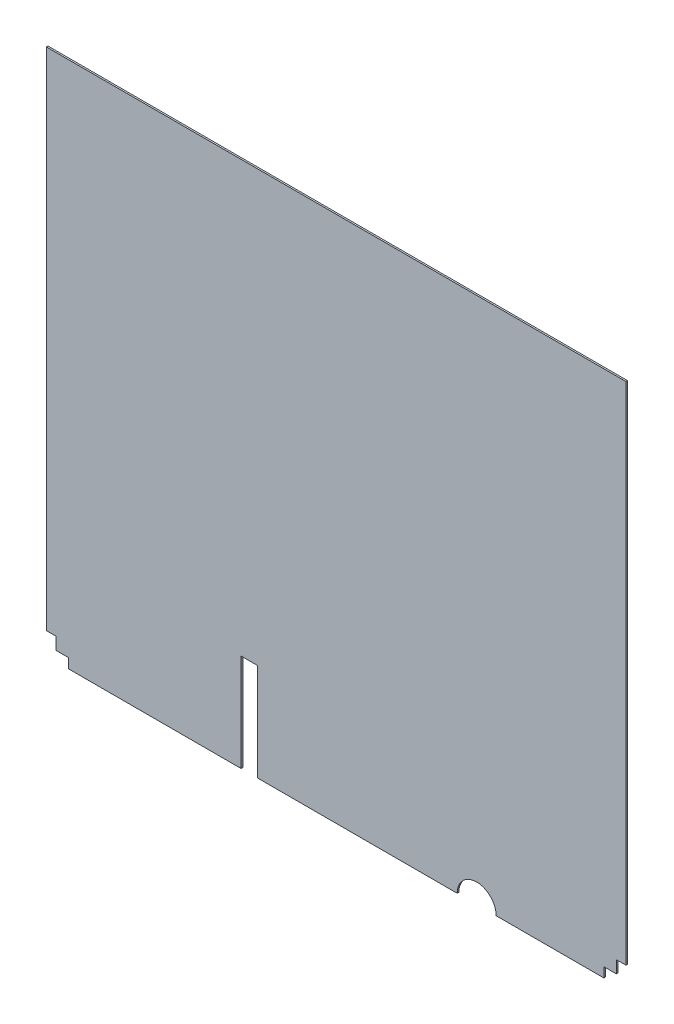
ISO-10303-21;
HEADER;
FILE_DESCRIPTION(('STEP AP214'),'2;1');
FILE_NAME('part.step','',(''),(''),'','','');
FILE_SCHEMA(('AUTOMOTIVE_DESIGN { 1 0 10303 214 1 1 1 1 }'));
ENDSEC;
DATA;
#1=APPLICATION_CONTEXT('core data for automotive mechanical design processes');
#2=APPLICATION_PROTOCOL_DEFINITION('international standard','automotive_design',2000,#1);
#3=PRODUCT_CONTEXT('',#1,'mechanical');
#4=PRODUCT('Part','Part','',(#3));
#5=PRODUCT_RELATED_PRODUCT_CATEGORY('part','',(#4));
#6=PRODUCT_DEFINITION_FORMATION('','',#4);
#7=PRODUCT_DEFINITION_CONTEXT('part definition',#1,'design');
#8=PRODUCT_DEFINITION('design','',#6,#7);
#9=PRODUCT_DEFINITION_SHAPE('','',#8);
#10=(LENGTH_UNIT() NAMED_UNIT(*) SI_UNIT(.MILLI.,.METRE.));
#11=(NAMED_UNIT(*) PLANE_ANGLE_UNIT() SI_UNIT($,.RADIAN.));
#12=(NAMED_UNIT(*) SI_UNIT($,.STERADIAN.) SOLID_ANGLE_UNIT());
#13=UNCERTAINTY_MEASURE_WITH_UNIT(LENGTH_MEASURE(1.E-05),#10,'distance_accuracy_value','');
#14=(GEOMETRIC_REPRESENTATION_CONTEXT(3) GLOBAL_UNCERTAINTY_ASSIGNED_CONTEXT((#13)) GLOBAL_UNIT_ASSIGNED_CONTEXT((#10,
#11,#12)) REPRESENTATION_CONTEXT('',''));
#15=CARTESIAN_POINT('',(0.,0.,0.));
#16=DIRECTION('',(0.,0.,1.));
#17=DIRECTION('',(1.,0.,0.));
#18=AXIS2_PLACEMENT_3D('',#15,#16,#17);
#19=CARTESIAN_POINT('',(673.32098,0.,2.54));
#20=DIRECTION('',(0.,0.,-1.));
#21=DIRECTION('',(-1.,0.,0.));
#22=AXIS2_PLACEMENT_3D('',#19,#20,#21);
#23=CYLINDRICAL_SURFACE('',#22,30.48);
#24=CARTESIAN_POINT('',(673.32098,0.,0.));
#25=DIRECTION('',(0.,0.,1.));
#26=DIRECTION('',(1.,0.,0.));
#27=AXIS2_PLACEMENT_3D('',#24,#25,#26);
#28=CIRCLE('',#27,30.48);
#29=CARTESIAN_POINT('',(703.80098,0.,0.));
#30=VERTEX_POINT('',#29);
#31=CARTESIAN_POINT('',(642.84098,0.,0.));
#32=VERTEX_POINT('',#31);
#33=EDGE_CURVE('E207',#30,#32,#28,.T.);
#34=ORIENTED_EDGE('',*,*,#33,.F.);
#35=DIRECTION('',(0.,0.,-1.));
#36=VECTOR('',#35,1.);
#37=CARTESIAN_POINT('',(703.80098,0.,2.54));
#38=LINE('',#37,#36);
#39=CARTESIAN_POINT('',(703.80098,0.,2.54));
#40=VERTEX_POINT('',#39);
#41=EDGE_CURVE('E11',#40,#30,#38,.T.);
#42=ORIENTED_EDGE('',*,*,#41,.F.);
#43=CARTESIAN_POINT('',(673.32098,0.,2.54));
#44=DIRECTION('',(0.,0.,1.));
#45=DIRECTION('',(1.,0.,0.));
#46=AXIS2_PLACEMENT_3D('',#43,#44,#45);
#47=CIRCLE('',#46,30.48);
#48=CARTESIAN_POINT('',(642.84098,0.,2.54));
#49=VERTEX_POINT('',#48);
#50=EDGE_CURVE('E338',#40,#49,#47,.T.);
#51=ORIENTED_EDGE('',*,*,#50,.T.);
#52=DIRECTION('',(0.,0.,-1.));
#53=VECTOR('',#52,1.);
#54=CARTESIAN_POINT('',(642.84098,0.,2.54));
#55=LINE('',#54,#53);
#56=EDGE_CURVE('E129',#49,#32,#55,.T.);
#57=ORIENTED_EDGE('',*,*,#56,.T.);
#58=EDGE_LOOP('',(#34,#42,#51,#57));
#59=FACE_BOUND('',#58,.T.);
#60=ADVANCED_FACE('F47',(#59),#23,.F.);
#61=CARTESIAN_POINT('',(0.,0.,2.54));
#62=DIRECTION('',(0.,1.,0.));
#63=DIRECTION('',(0.,0.,1.));
#64=AXIS2_PLACEMENT_3D('',#61,#62,#63);
#65=PLANE('',#64);
#66=DIRECTION('',(1.,0.,0.));
#67=VECTOR('',#66,1.);
#68=CARTESIAN_POINT('',(0.,0.,0.));
#69=LINE('',#68,#67);
#70=CARTESIAN_POINT('',(872.45698,0.,0.));
#71=VERTEX_POINT('',#70);
#72=EDGE_CURVE('E211',#30,#71,#69,.T.);
#73=ORIENTED_EDGE('',*,*,#72,.T.);
#74=DIRECTION('',(0.,0.,-1.));
#75=VECTOR('',#74,1.);
#76=CARTESIAN_POINT('',(872.45698,0.,2.54));
#77=LINE('',#76,#75);
#78=CARTESIAN_POINT('',(872.45698,0.,2.54));
#79=VERTEX_POINT('',#78);
#80=EDGE_CURVE('E56',#79,#71,#77,.T.);
#81=ORIENTED_EDGE('',*,*,#80,.F.);
#82=DIRECTION('',(1.,0.,0.));
#83=VECTOR('',#82,1.);
#84=CARTESIAN_POINT('',(0.,0.,2.54));
#85=LINE('',#84,#83);
#86=EDGE_CURVE('E204',#40,#79,#85,.T.);
#87=ORIENTED_EDGE('',*,*,#86,.F.);
#88=ORIENTED_EDGE('',*,*,#41,.T.);
#89=EDGE_LOOP('',(#73,#81,#87,#88));
#90=FACE_BOUND('',#89,.T.);
#91=ADVANCED_FACE('F320',(#90),#65,.F.);
#92=CARTESIAN_POINT('',(872.45698,0.,2.54));
#93=DIRECTION('',(1.,0.,0.));
#94=DIRECTION('',(0.,0.,-1.));
#95=AXIS2_PLACEMENT_3D('',#92,#93,#94);
#96=PLANE('',#95);
#97=DIRECTION('',(0.,-1.,0.));
#98=VECTOR('',#97,1.);
#99=CARTESIAN_POINT('',(872.45698,0.,0.));
#100=LINE('',#99,#98);
#101=CARTESIAN_POINT('',(872.45698,15.24,0.));
#102=VERTEX_POINT('',#101);
#103=EDGE_CURVE('E215',#102,#71,#100,.T.);
#104=ORIENTED_EDGE('',*,*,#103,.F.);
#105=DIRECTION('',(0.,0.,-1.));
#106=VECTOR('',#105,1.);
#107=CARTESIAN_POINT('',(872.45698,15.24,2.54));
#108=LINE('',#107,#106);
#109=CARTESIAN_POINT('',(872.45698,15.24,2.54));
#110=VERTEX_POINT('',#109);
#111=EDGE_CURVE('E308',#110,#102,#108,.T.);
#112=ORIENTED_EDGE('',*,*,#111,.F.);
#113=DIRECTION('',(0.,-1.,0.));
#114=VECTOR('',#113,1.);
#115=CARTESIAN_POINT('',(872.45698,0.,2.54));
#116=LINE('',#115,#114);
#117=EDGE_CURVE('E317',#110,#79,#116,.T.);
#118=ORIENTED_EDGE('',*,*,#117,.T.);
#119=ORIENTED_EDGE('',*,*,#80,.T.);
#120=EDGE_LOOP('',(#104,#112,#118,#119));
#121=FACE_BOUND('',#120,.T.);
#122=ADVANCED_FACE('F315',(#121),#96,.T.);
#123=CARTESIAN_POINT('',(0.,15.2399999999999,2.54));
#124=DIRECTION('',(0.,-1.,0.));
#125=DIRECTION('',(1.,0.,0.));
#126=AXIS2_PLACEMENT_3D('',#123,#124,#125);
#127=PLANE('',#126);
#128=DIRECTION('',(-1.,0.,0.));
#129=VECTOR('',#128,1.);
#130=CARTESIAN_POINT('',(0.,15.2399999999999,0.));
#131=LINE('',#130,#129);
#132=CARTESIAN_POINT('',(891.76098,15.24,0.));
#133=VERTEX_POINT('',#132);
#134=EDGE_CURVE('E221',#133,#102,#131,.T.);
#135=ORIENTED_EDGE('',*,*,#134,.F.);
#136=DIRECTION('',(0.,0.,-1.));
#137=VECTOR('',#136,1.);
#138=CARTESIAN_POINT('',(891.76098,15.24,2.54));
#139=LINE('',#138,#137);
#140=CARTESIAN_POINT('',(891.76098,15.24,2.54));
#141=VERTEX_POINT('',#140);
#142=EDGE_CURVE('E305',#141,#133,#139,.T.);
#143=ORIENTED_EDGE('',*,*,#142,.F.);
#144=DIRECTION('',(-1.,0.,0.));
#145=VECTOR('',#144,1.);
#146=CARTESIAN_POINT('',(0.,15.2399999999999,2.54));
#147=LINE('',#146,#145);
#148=EDGE_CURVE('E329',#141,#110,#147,.T.);
#149=ORIENTED_EDGE('',*,*,#148,.T.);
#150=ORIENTED_EDGE('',*,*,#111,.T.);
#151=EDGE_LOOP('',(#135,#143,#149,#150));
#152=FACE_BOUND('',#151,.T.);
#153=ADVANCED_FACE('F326',(#152),#127,.T.);
#154=CARTESIAN_POINT('',(891.76098,0.,2.54));
#155=DIRECTION('',(1.,0.,0.));
#156=DIRECTION('',(0.,0.,-1.));
#157=AXIS2_PLACEMENT_3D('',#154,#155,#156);
#158=PLANE('',#157);
#159=DIRECTION('',(0.,-1.,0.));
#160=VECTOR('',#159,1.);
#161=CARTESIAN_POINT('',(891.76098,0.,0.));
#162=LINE('',#161,#160);
#163=CARTESIAN_POINT('',(891.76098,34.544,0.));
#164=VERTEX_POINT('',#163);
#165=EDGE_CURVE('E225',#164,#133,#162,.T.);
#166=ORIENTED_EDGE('',*,*,#165,.F.);
#167=DIRECTION('',(0.,0.,-1.));
#168=VECTOR('',#167,1.);
#169=CARTESIAN_POINT('',(891.76098,34.544,2.54));
#170=LINE('',#169,#168);
#171=CARTESIAN_POINT('',(891.76098,34.544,2.54));
#172=VERTEX_POINT('',#171);
#173=EDGE_CURVE('E302',#172,#164,#170,.T.);
#174=ORIENTED_EDGE('',*,*,#173,.F.);
#175=DIRECTION('',(0.,-1.,0.));
#176=VECTOR('',#175,1.);
#177=CARTESIAN_POINT('',(891.76098,0.,2.54));
#178=LINE('',#177,#176);
#179=EDGE_CURVE('E336',#172,#141,#178,.T.);
#180=ORIENTED_EDGE('',*,*,#179,.T.);
#181=ORIENTED_EDGE('',*,*,#142,.T.);
#182=EDGE_LOOP('',(#166,#174,#180,#181));
#183=FACE_BOUND('',#182,.T.);
#184=ADVANCED_FACE('F442',(#183),#158,.T.);
#185=CARTESIAN_POINT('',(0.,34.5439999999996,2.54));
#186=DIRECTION('',(0.,-1.,0.));
#187=DIRECTION('',(1.,0.,0.));
#188=AXIS2_PLACEMENT_3D('',#185,#186,#187);
#189=PLANE('',#188);
#190=DIRECTION('',(-1.,0.,0.));
#191=VECTOR('',#190,1.);
#192=CARTESIAN_POINT('',(0.,34.5439999999996,0.));
#193=LINE('',#192,#191);
#194=CARTESIAN_POINT('',(907.00098,34.544,0.));
#195=VERTEX_POINT('',#194);
#196=EDGE_CURVE('E229',#195,#164,#193,.T.);
#197=ORIENTED_EDGE('',*,*,#196,.F.);
#198=DIRECTION('',(0.,0.,-1.));
#199=VECTOR('',#198,1.);
#200=CARTESIAN_POINT('',(907.00098,34.544,2.54));
#201=LINE('',#200,#199);
#202=CARTESIAN_POINT('',(907.00098,34.544,2.54));
#203=VERTEX_POINT('',#202);
#204=EDGE_CURVE('E299',#203,#195,#201,.T.);
#205=ORIENTED_EDGE('',*,*,#204,.F.);
#206=DIRECTION('',(-1.,0.,0.));
#207=VECTOR('',#206,1.);
#208=CARTESIAN_POINT('',(0.,34.5439999999996,2.54));
#209=LINE('',#208,#207);
#210=EDGE_CURVE('E343',#203,#172,#209,.T.);
#211=ORIENTED_EDGE('',*,*,#210,.T.);
#212=ORIENTED_EDGE('',*,*,#173,.T.);
#213=EDGE_LOOP('',(#197,#205,#211,#212));
#214=FACE_BOUND('',#213,.T.);
#215=ADVANCED_FACE('F438',(#214),#189,.T.);
#216=CARTESIAN_POINT('',(907.00098,0.,2.54));
#217=DIRECTION('',(-1.,0.,0.));
#218=DIRECTION('',(0.,0.,1.));
#219=AXIS2_PLACEMENT_3D('',#216,#217,#218);
#220=PLANE('',#219);
#221=DIRECTION('',(0.,1.,0.));
#222=VECTOR('',#221,1.);
#223=CARTESIAN_POINT('',(907.00098,0.,0.));
#224=LINE('',#223,#222);
#225=CARTESIAN_POINT('',(907.00098,825.5,0.));
#226=VERTEX_POINT('',#225);
#227=EDGE_CURVE('E233',#195,#226,#224,.T.);
#228=ORIENTED_EDGE('',*,*,#227,.T.);
#229=DIRECTION('',(0.,0.,-1.));
#230=VECTOR('',#229,1.);
#231=CARTESIAN_POINT('',(907.00098,825.5,2.54));
#232=LINE('',#231,#230);
#233=CARTESIAN_POINT('',(907.00098,825.5,2.54));
#234=VERTEX_POINT('',#233);
#235=EDGE_CURVE('E296',#234,#226,#232,.T.);
#236=ORIENTED_EDGE('',*,*,#235,.F.);
#237=DIRECTION('',(0.,1.,0.));
#238=VECTOR('',#237,1.);
#239=CARTESIAN_POINT('',(907.00098,0.,2.54));
#240=LINE('',#239,#238);
#241=EDGE_CURVE('E347',#203,#234,#240,.T.);
#242=ORIENTED_EDGE('',*,*,#241,.F.);
#243=ORIENTED_EDGE('',*,*,#204,.T.);
#244=EDGE_LOOP('',(#228,#236,#242,#243));
#245=FACE_BOUND('',#244,.T.);
#246=ADVANCED_FACE('F434',(#245),#220,.F.);
#247=CARTESIAN_POINT('',(0.,825.5,2.54));
#248=DIRECTION('',(0.,1.,0.));
#249=DIRECTION('',(0.,0.,1.));
#250=AXIS2_PLACEMENT_3D('',#247,#248,#249);
#251=PLANE('',#250);
#252=DIRECTION('',(1.,0.,0.));
#253=VECTOR('',#252,1.);
#254=CARTESIAN_POINT('',(0.,825.5,0.));
#255=LINE('',#254,#253);
#256=CARTESIAN_POINT('',(0.,825.5,0.));
#257=VERTEX_POINT('',#256);
#258=EDGE_CURVE('E237',#257,#226,#255,.T.);
#259=ORIENTED_EDGE('',*,*,#258,.F.);
#260=DIRECTION('',(0.,0.,-1.));
#261=VECTOR('',#260,1.);
#262=CARTESIAN_POINT('',(0.,825.5,2.54));
#263=LINE('',#262,#261);
#264=CARTESIAN_POINT('',(0.,825.5,2.54));
#265=VERTEX_POINT('',#264);
#266=EDGE_CURVE('E293',#265,#257,#263,.T.);
#267=ORIENTED_EDGE('',*,*,#266,.F.);
#268=DIRECTION('',(1.,0.,0.));
#269=VECTOR('',#268,1.);
#270=CARTESIAN_POINT('',(0.,825.5,2.54));
#271=LINE('',#270,#269);
#272=EDGE_CURVE('E350',#265,#234,#271,.T.);
#273=ORIENTED_EDGE('',*,*,#272,.T.);
#274=ORIENTED_EDGE('',*,*,#235,.T.);
#275=EDGE_LOOP('',(#259,#267,#273,#274));
#276=FACE_BOUND('',#275,.T.);
#277=ADVANCED_FACE('F430',(#276),#251,.T.);
#278=CARTESIAN_POINT('',(0.,0.,2.54));
#279=DIRECTION('',(-1.,0.,0.));
#280=DIRECTION('',(0.,0.,1.));
#281=AXIS2_PLACEMENT_3D('',#278,#279,#280);
#282=PLANE('',#281);
#283=DIRECTION('',(0.,1.,0.));
#284=VECTOR('',#283,1.);
#285=CARTESIAN_POINT('',(0.,0.,0.));
#286=LINE('',#285,#284);
#287=CARTESIAN_POINT('',(0.,34.544,0.));
#288=VERTEX_POINT('',#287);
#289=EDGE_CURVE('E241',#288,#257,#286,.T.);
#290=ORIENTED_EDGE('',*,*,#289,.F.);
#291=DIRECTION('',(0.,0.,-1.));
#292=VECTOR('',#291,1.);
#293=CARTESIAN_POINT('',(0.,34.544,2.54));
#294=LINE('',#293,#292);
#295=CARTESIAN_POINT('',(0.,34.544,2.54));
#296=VERTEX_POINT('',#295);
#297=EDGE_CURVE('E290',#296,#288,#294,.T.);
#298=ORIENTED_EDGE('',*,*,#297,.F.);
#299=DIRECTION('',(0.,1.,0.));
#300=VECTOR('',#299,1.);
#301=CARTESIAN_POINT('',(0.,0.,2.54));
#302=LINE('',#301,#300);
#303=EDGE_CURVE('E354',#296,#265,#302,.T.);
#304=ORIENTED_EDGE('',*,*,#303,.T.);
#305=ORIENTED_EDGE('',*,*,#266,.T.);
#306=EDGE_LOOP('',(#290,#298,#304,#305));
#307=FACE_BOUND('',#306,.T.);
#308=ADVANCED_FACE('F426',(#307),#282,.T.);
#309=CARTESIAN_POINT('',(0.,34.544,2.54));
#310=DIRECTION('',(0.,1.,0.));
#311=DIRECTION('',(0.,0.,1.));
#312=AXIS2_PLACEMENT_3D('',#309,#310,#311);
#313=PLANE('',#312);
#314=DIRECTION('',(1.,0.,0.));
#315=VECTOR('',#314,1.);
#316=CARTESIAN_POINT('',(0.,34.544,0.));
#317=LINE('',#316,#315);
#318=CARTESIAN_POINT('',(15.24,34.544,0.));
#319=VERTEX_POINT('',#318);
#320=EDGE_CURVE('E245',#288,#319,#317,.T.);
#321=ORIENTED_EDGE('',*,*,#320,.T.);
#322=DIRECTION('',(0.,0.,-1.));
#323=VECTOR('',#322,1.);
#324=CARTESIAN_POINT('',(15.24,34.544,2.54));
#325=LINE('',#324,#323);
#326=CARTESIAN_POINT('',(15.24,34.544,2.54));
#327=VERTEX_POINT('',#326);
#328=EDGE_CURVE('E286',#327,#319,#325,.T.);
#329=ORIENTED_EDGE('',*,*,#328,.F.);
#330=DIRECTION('',(1.,0.,0.));
#331=VECTOR('',#330,1.);
#332=CARTESIAN_POINT('',(0.,34.544,2.54));
#333=LINE('',#332,#331);
#334=EDGE_CURVE('E358',#296,#327,#333,.T.);
#335=ORIENTED_EDGE('',*,*,#334,.F.);
#336=ORIENTED_EDGE('',*,*,#297,.T.);
#337=EDGE_LOOP('',(#321,#329,#335,#336));
#338=FACE_BOUND('',#337,.T.);
#339=ADVANCED_FACE('F422',(#338),#313,.F.);
#340=CARTESIAN_POINT('',(15.24,0.,2.54));
#341=DIRECTION('',(1.,0.,0.));
#342=DIRECTION('',(0.,1.,0.));
#343=AXIS2_PLACEMENT_3D('',#340,#341,#342);
#344=PLANE('',#343);
#345=DIRECTION('',(0.,-1.,0.));
#346=VECTOR('',#345,1.);
#347=CARTESIAN_POINT('',(15.24,0.,0.));
#348=LINE('',#347,#346);
#349=CARTESIAN_POINT('',(15.24,15.24,0.));
#350=VERTEX_POINT('',#349);
#351=EDGE_CURVE('E248',#319,#350,#348,.T.);
#352=ORIENTED_EDGE('',*,*,#351,.T.);
#353=DIRECTION('',(0.,0.,-1.));
#354=VECTOR('',#353,1.);
#355=CARTESIAN_POINT('',(15.24,15.24,2.54));
#356=LINE('',#355,#354);
#357=CARTESIAN_POINT('',(15.24,15.24,2.54));
#358=VERTEX_POINT('',#357);
#359=EDGE_CURVE('E282',#358,#350,#356,.T.);
#360=ORIENTED_EDGE('',*,*,#359,.F.);
#361=DIRECTION('',(0.,-1.,0.));
#362=VECTOR('',#361,1.);
#363=CARTESIAN_POINT('',(15.24,0.,2.54));
#364=LINE('',#363,#362);
#365=EDGE_CURVE('E361',#327,#358,#364,.T.);
#366=ORIENTED_EDGE('',*,*,#365,.F.);
#367=ORIENTED_EDGE('',*,*,#328,.T.);
#368=EDGE_LOOP('',(#352,#360,#366,#367));
#369=FACE_BOUND('',#368,.T.);
#370=ADVANCED_FACE('F418',(#369),#344,.F.);
#371=CARTESIAN_POINT('',(0.,15.24,2.54));
#372=DIRECTION('',(0.,1.,0.));
#373=DIRECTION('',(0.,0.,1.));
#374=AXIS2_PLACEMENT_3D('',#371,#372,#373);
#375=PLANE('',#374);
#376=DIRECTION('',(1.,0.,0.));
#377=VECTOR('',#376,1.);
#378=CARTESIAN_POINT('',(0.,15.24,0.));
#379=LINE('',#378,#377);
#380=CARTESIAN_POINT('',(34.544,15.24,0.));
#381=VERTEX_POINT('',#380);
#382=EDGE_CURVE('E251',#350,#381,#379,.T.);
#383=ORIENTED_EDGE('',*,*,#382,.T.);
#384=DIRECTION('',(0.,0.,-1.));
#385=VECTOR('',#384,1.);
#386=CARTESIAN_POINT('',(34.544,15.24,2.54));
#387=LINE('',#386,#385);
#388=CARTESIAN_POINT('',(34.544,15.24,2.54));
#389=VERTEX_POINT('',#388);
#390=EDGE_CURVE('E278',#389,#381,#387,.T.);
#391=ORIENTED_EDGE('',*,*,#390,.F.);
#392=DIRECTION('',(1.,0.,0.));
#393=VECTOR('',#392,1.);
#394=CARTESIAN_POINT('',(0.,15.24,2.54));
#395=LINE('',#394,#393);
#396=EDGE_CURVE('E364',#358,#389,#395,.T.);
#397=ORIENTED_EDGE('',*,*,#396,.F.);
#398=ORIENTED_EDGE('',*,*,#359,.T.);
#399=EDGE_LOOP('',(#383,#391,#397,#398));
#400=FACE_BOUND('',#399,.T.);
#401=ADVANCED_FACE('F414',(#400),#375,.F.);
#402=CARTESIAN_POINT('',(34.544,0.,2.54));
#403=DIRECTION('',(1.,0.,0.));
#404=DIRECTION('',(0.,0.,-1.));
#405=AXIS2_PLACEMENT_3D('',#402,#403,#404);
#406=PLANE('',#405);
#407=DIRECTION('',(0.,-1.,0.));
#408=VECTOR('',#407,1.);
#409=CARTESIAN_POINT('',(34.544,0.,0.));
#410=LINE('',#409,#408);
#411=CARTESIAN_POINT('',(34.544,0.,0.));
#412=VERTEX_POINT('',#411);
#413=EDGE_CURVE('E254',#381,#412,#410,.T.);
#414=ORIENTED_EDGE('',*,*,#413,.T.);
#415=DIRECTION('',(0.,0.,-1.));
#416=VECTOR('',#415,1.);
#417=CARTESIAN_POINT('',(34.544,0.,2.54));
#418=LINE('',#417,#416);
#419=CARTESIAN_POINT('',(34.544,0.,2.54));
#420=VERTEX_POINT('',#419);
#421=EDGE_CURVE('E274',#420,#412,#418,.T.);
#422=ORIENTED_EDGE('',*,*,#421,.F.);
#423=DIRECTION('',(0.,-1.,0.));
#424=VECTOR('',#423,1.);
#425=CARTESIAN_POINT('',(34.544,0.,2.54));
#426=LINE('',#425,#424);
#427=EDGE_CURVE('E367',#389,#420,#426,.T.);
#428=ORIENTED_EDGE('',*,*,#427,.F.);
#429=ORIENTED_EDGE('',*,*,#390,.T.);
#430=EDGE_LOOP('',(#414,#422,#428,#429));
#431=FACE_BOUND('',#430,.T.);
#432=ADVANCED_FACE('F398',(#431),#406,.F.);
#433=CARTESIAN_POINT('',(304.8,0.,0.));
#434=VERTEX_POINT('',#433);
#435=EDGE_CURVE('E217',#412,#434,#69,.T.);
#436=ORIENTED_EDGE('',*,*,#435,.T.);
#437=DIRECTION('',(0.,0.,-1.));
#438=VECTOR('',#437,1.);
#439=CARTESIAN_POINT('',(304.8,0.,2.54));
#440=LINE('',#439,#438);
#441=CARTESIAN_POINT('',(304.8,0.,2.54));
#442=VERTEX_POINT('',#441);
#443=EDGE_CURVE('E270',#442,#434,#440,.T.);
#444=ORIENTED_EDGE('',*,*,#443,.F.);
#445=EDGE_CURVE('E203',#420,#442,#85,.T.);
#446=ORIENTED_EDGE('',*,*,#445,.F.);
#447=ORIENTED_EDGE('',*,*,#421,.T.);
#448=EDGE_LOOP('',(#436,#444,#446,#447));
#449=FACE_BOUND('',#448,.T.);
#450=ADVANCED_FACE('F376',(#449),#65,.F.);
#451=CARTESIAN_POINT('',(304.8,0.,2.54));
#452=DIRECTION('',(-1.,0.,0.));
#453=DIRECTION('',(0.,0.,1.));
#454=AXIS2_PLACEMENT_3D('',#451,#452,#453);
#455=PLANE('',#454);
#456=DIRECTION('',(0.,1.,0.));
#457=VECTOR('',#456,1.);
#458=CARTESIAN_POINT('',(304.8,0.,0.));
#459=LINE('',#458,#457);
#460=CARTESIAN_POINT('',(304.8,152.4,0.));
#461=VERTEX_POINT('',#460);
#462=EDGE_CURVE('E257',#434,#461,#459,.T.);
#463=ORIENTED_EDGE('',*,*,#462,.T.);
#464=DIRECTION('',(0.,0.,-1.));
#465=VECTOR('',#464,1.);
#466=CARTESIAN_POINT('',(304.8,152.4,2.54));
#467=LINE('',#466,#465);
#468=CARTESIAN_POINT('',(304.8,152.4,2.54));
#469=VERTEX_POINT('',#468);
#470=EDGE_CURVE('E195',#469,#461,#467,.T.);
#471=ORIENTED_EDGE('',*,*,#470,.F.);
#472=DIRECTION('',(0.,1.,0.));
#473=VECTOR('',#472,1.);
#474=CARTESIAN_POINT('',(304.8,0.,2.54));
#475=LINE('',#474,#473);
#476=EDGE_CURVE('E184',#442,#469,#475,.T.);
#477=ORIENTED_EDGE('',*,*,#476,.F.);
#478=ORIENTED_EDGE('',*,*,#443,.T.);
#479=EDGE_LOOP('',(#463,#471,#477,#478));
#480=FACE_BOUND('',#479,.T.);
#481=ADVANCED_FACE('F380',(#480),#455,.F.);
#482=CARTESIAN_POINT('',(0.,152.4,2.54));
#483=DIRECTION('',(0.,1.,0.));
#484=DIRECTION('',(0.,0.,1.));
#485=AXIS2_PLACEMENT_3D('',#482,#483,#484);
#486=PLANE('',#485);
#487=DIRECTION('',(1.,0.,0.));
#488=VECTOR('',#487,1.);
#489=CARTESIAN_POINT('',(0.,152.4,0.));
#490=LINE('',#489,#488);
#491=CARTESIAN_POINT('',(330.2,152.4,0.));
#492=VERTEX_POINT('',#491);
#493=EDGE_CURVE('E193',#461,#492,#490,.T.);
#494=ORIENTED_EDGE('',*,*,#493,.T.);
#495=DIRECTION('',(0.,0.,-1.));
#496=VECTOR('',#495,1.);
#497=CARTESIAN_POINT('',(330.2,152.4,2.54));
#498=LINE('',#497,#496);
#499=CARTESIAN_POINT('',(330.2,152.4,2.54));
#500=VERTEX_POINT('',#499);
#501=EDGE_CURVE('E190',#500,#492,#498,.T.);
#502=ORIENTED_EDGE('',*,*,#501,.F.);
#503=DIRECTION('',(1.,0.,0.));
#504=VECTOR('',#503,1.);
#505=CARTESIAN_POINT('',(0.,152.4,2.54));
#506=LINE('',#505,#504);
#507=EDGE_CURVE('E178',#469,#500,#506,.T.);
#508=ORIENTED_EDGE('',*,*,#507,.F.);
#509=ORIENTED_EDGE('',*,*,#470,.T.);
#510=EDGE_LOOP('',(#494,#502,#508,#509));
#511=FACE_BOUND('',#510,.T.);
#512=ADVANCED_FACE('F191',(#511),#486,.F.);
#513=CARTESIAN_POINT('',(330.2,1.20274161001059E-13,2.54));
#514=DIRECTION('',(1.,0.,0.));
#515=DIRECTION('',(0.,1.,0.));
#516=AXIS2_PLACEMENT_3D('',#513,#514,#515);
#517=PLANE('',#516);
#518=DIRECTION('',(0.,-1.,0.));
#519=VECTOR('',#518,1.);
#520=CARTESIAN_POINT('',(330.2,1.20274161001059E-13,0.));
#521=LINE('',#520,#519);
#522=CARTESIAN_POINT('',(330.2,0.,0.));
#523=VERTEX_POINT('',#522);
#524=EDGE_CURVE('E122',#492,#523,#521,.T.);
#525=ORIENTED_EDGE('',*,*,#524,.T.);
#526=DIRECTION('',(0.,0.,-1.));
#527=VECTOR('',#526,1.);
#528=CARTESIAN_POINT('',(330.2,0.,2.54));
#529=LINE('',#528,#527);
#530=CARTESIAN_POINT('',(330.2,0.,2.54));
#531=VERTEX_POINT('',#530);
#532=EDGE_CURVE('E196',#531,#523,#529,.T.);
#533=ORIENTED_EDGE('',*,*,#532,.F.);
#534=DIRECTION('',(0.,-1.,0.));
#535=VECTOR('',#534,1.);
#536=CARTESIAN_POINT('',(330.2,1.20274161001059E-13,2.54));
#537=LINE('',#536,#535);
#538=EDGE_CURVE('E182',#500,#531,#537,.T.);
#539=ORIENTED_EDGE('',*,*,#538,.F.);
#540=ORIENTED_EDGE('',*,*,#501,.T.);
#541=EDGE_LOOP('',(#525,#533,#539,#540));
#542=FACE_BOUND('',#541,.T.);
#543=ADVANCED_FACE('F198',(#542),#517,.F.);
#544=EDGE_CURVE('E216',#523,#32,#69,.T.);
#545=ORIENTED_EDGE('',*,*,#544,.T.);
#546=ORIENTED_EDGE('',*,*,#56,.F.);
#547=EDGE_CURVE('E64',#531,#49,#85,.T.);
#548=ORIENTED_EDGE('',*,*,#547,.F.);
#549=ORIENTED_EDGE('',*,*,#532,.T.);
#550=EDGE_LOOP('',(#545,#546,#548,#549));
#551=FACE_BOUND('',#550,.T.);
#552=ADVANCED_FACE('F391',(#551),#65,.F.);
#553=CARTESIAN_POINT('',(0.,0.,2.54));
#554=DIRECTION('',(0.,0.,1.));
#555=DIRECTION('',(1.,0.,0.));
#556=AXIS2_PLACEMENT_3D('',#553,#554,#555);
#557=PLANE('',#556);
#558=ORIENTED_EDGE('',*,*,#50,.F.);
#559=ORIENTED_EDGE('',*,*,#86,.T.);
#560=ORIENTED_EDGE('',*,*,#117,.F.);
#561=ORIENTED_EDGE('',*,*,#148,.F.);
#562=ORIENTED_EDGE('',*,*,#179,.F.);
#563=ORIENTED_EDGE('',*,*,#210,.F.);
#564=ORIENTED_EDGE('',*,*,#241,.T.);
#565=ORIENTED_EDGE('',*,*,#272,.F.);
#566=ORIENTED_EDGE('',*,*,#303,.F.);
#567=ORIENTED_EDGE('',*,*,#334,.T.);
#568=ORIENTED_EDGE('',*,*,#365,.T.);
#569=ORIENTED_EDGE('',*,*,#396,.T.);
#570=ORIENTED_EDGE('',*,*,#427,.T.);
#571=ORIENTED_EDGE('',*,*,#445,.T.);
#572=ORIENTED_EDGE('',*,*,#476,.T.);
#573=ORIENTED_EDGE('',*,*,#507,.T.);
#574=ORIENTED_EDGE('',*,*,#538,.T.);
#575=ORIENTED_EDGE('',*,*,#547,.T.);
#576=EDGE_LOOP('',(#558,#559,#560,#561,#562,#563,#564,#565,#566,#567,#568,#569,#570,#571,#572,
#573,#574,#575));
#577=FACE_BOUND('',#576,.T.);
#578=ADVANCED_FACE('F180',(#577),#557,.T.);
#579=CARTESIAN_POINT('',(0.,0.,0.));
#580=DIRECTION('',(0.,0.,1.));
#581=DIRECTION('',(1.,0.,0.));
#582=AXIS2_PLACEMENT_3D('',#579,#580,#581);
#583=PLANE('',#582);
#584=ORIENTED_EDGE('',*,*,#33,.T.);
#585=ORIENTED_EDGE('',*,*,#544,.F.);
#586=ORIENTED_EDGE('',*,*,#524,.F.);
#587=ORIENTED_EDGE('',*,*,#493,.F.);
#588=ORIENTED_EDGE('',*,*,#462,.F.);
#589=ORIENTED_EDGE('',*,*,#435,.F.);
#590=ORIENTED_EDGE('',*,*,#413,.F.);
#591=ORIENTED_EDGE('',*,*,#382,.F.);
#592=ORIENTED_EDGE('',*,*,#351,.F.);
#593=ORIENTED_EDGE('',*,*,#320,.F.);
#594=ORIENTED_EDGE('',*,*,#289,.T.);
#595=ORIENTED_EDGE('',*,*,#258,.T.);
#596=ORIENTED_EDGE('',*,*,#227,.F.);
#597=ORIENTED_EDGE('',*,*,#196,.T.);
#598=ORIENTED_EDGE('',*,*,#165,.T.);
#599=ORIENTED_EDGE('',*,*,#134,.T.);
#600=ORIENTED_EDGE('',*,*,#103,.T.);
#601=ORIENTED_EDGE('',*,*,#72,.F.);
#602=EDGE_LOOP('',(#584,#585,#586,#587,#588,#589,#590,#591,#592,#593,#594,#595,#596,#597,#598,
#599,#600,#601));
#603=FACE_BOUND('',#602,.T.);
#604=ADVANCED_FACE('F322',(#603),#583,.F.);
#605=CLOSED_SHELL('',(#60,#91,#122,#153,#184,#215,#246,#277,#308,#339,#370,#401,#432,#450,#481,
#512,#543,#552,#578,#604));
#606=MANIFOLD_SOLID_BREP('B2',#605);
#607=ADVANCED_BREP_SHAPE_REPRESENTATION('',(#18,#606),#14);
#608=SHAPE_DEFINITION_REPRESENTATION(#9,#607);
ENDSEC;
END-ISO-10303-21;
